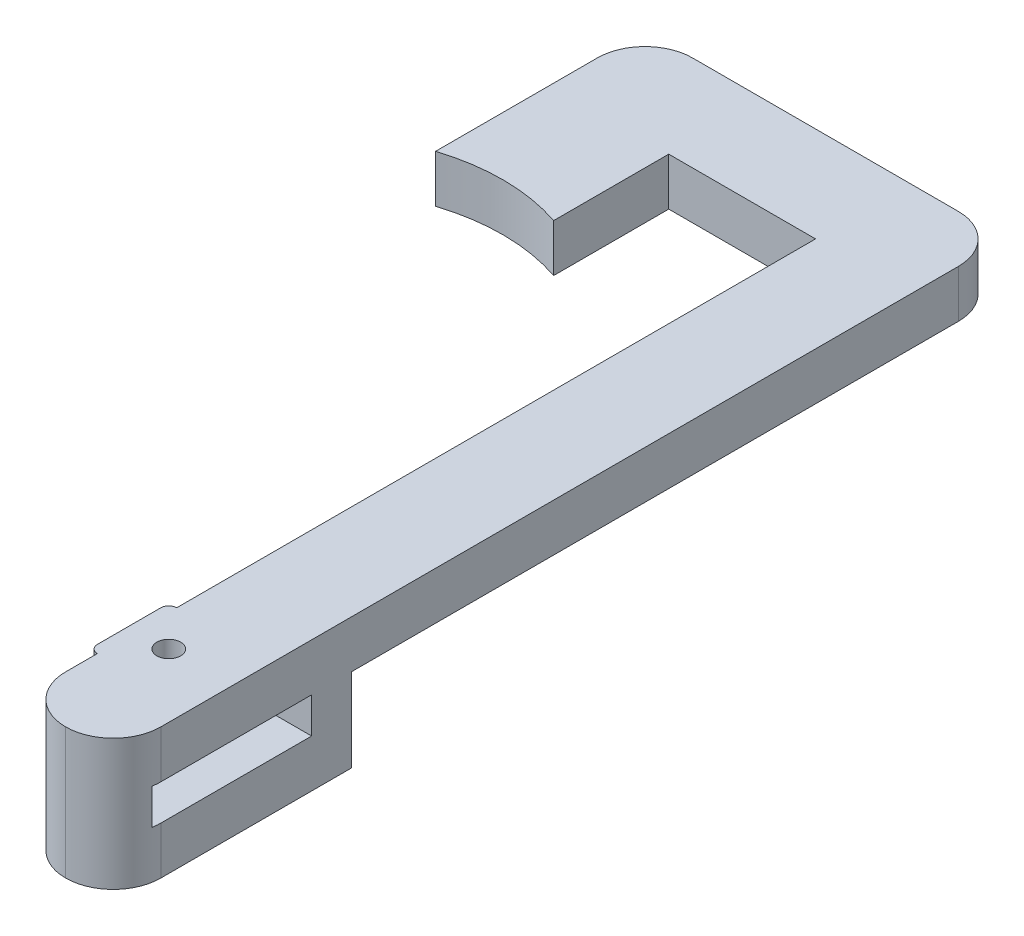
ISO-10303-21;
HEADER;
FILE_DESCRIPTION(('STEP AP214'),'2;1');
FILE_NAME('part.step','',(''),(''),'','','');
FILE_SCHEMA(('AUTOMOTIVE_DESIGN { 1 0 10303 214 1 1 1 1 }'));
ENDSEC;
DATA;
#1=APPLICATION_CONTEXT('core data for automotive mechanical design processes');
#2=APPLICATION_PROTOCOL_DEFINITION('international standard','automotive_design',2000,#1);
#3=PRODUCT_CONTEXT('',#1,'mechanical');
#4=PRODUCT('Part','Part','',(#3));
#5=PRODUCT_RELATED_PRODUCT_CATEGORY('part','',(#4));
#6=PRODUCT_DEFINITION_FORMATION('','',#4);
#7=PRODUCT_DEFINITION_CONTEXT('part definition',#1,'design');
#8=PRODUCT_DEFINITION('design','',#6,#7);
#9=PRODUCT_DEFINITION_SHAPE('','',#8);
#10=(LENGTH_UNIT() NAMED_UNIT(*) SI_UNIT(.MILLI.,.METRE.));
#11=(NAMED_UNIT(*) PLANE_ANGLE_UNIT() SI_UNIT($,.RADIAN.));
#12=(NAMED_UNIT(*) SI_UNIT($,.STERADIAN.) SOLID_ANGLE_UNIT());
#13=UNCERTAINTY_MEASURE_WITH_UNIT(LENGTH_MEASURE(1.E-05),#10,'distance_accuracy_value','');
#14=(GEOMETRIC_REPRESENTATION_CONTEXT(3) GLOBAL_UNCERTAINTY_ASSIGNED_CONTEXT((#13)) GLOBAL_UNIT_ASSIGNED_CONTEXT((#10,
#11,#12)) REPRESENTATION_CONTEXT('',''));
#15=CARTESIAN_POINT('',(0.,0.,0.));
#16=DIRECTION('',(0.,0.,1.));
#17=DIRECTION('',(1.,0.,0.));
#18=AXIS2_PLACEMENT_3D('',#15,#16,#17);
#19=CARTESIAN_POINT('',(-2.00000000000002,3.,0.));
#20=DIRECTION('',(-1.,0.,0.));
#21=DIRECTION('',(0.,0.,1.));
#22=AXIS2_PLACEMENT_3D('',#19,#20,#21);
#23=PLANE('',#22);
#24=DIRECTION('',(0.,1.,0.));
#25=VECTOR('',#24,1.);
#26=CARTESIAN_POINT('',(-2.00000000000001,-10.2749378105604,-2.5));
#27=LINE('',#26,#25);
#28=CARTESIAN_POINT('',(-2.00000000000001,-5.25,-2.5));
#29=VERTEX_POINT('',#28);
#30=CARTESIAN_POINT('',(-2.00000000000001,-2.25,-2.5));
#31=VERTEX_POINT('',#30);
#32=EDGE_CURVE('E220',#29,#31,#27,.T.);
#33=ORIENTED_EDGE('',*,*,#32,.T.);
#34=DIRECTION('',(0.,0.,1.));
#35=VECTOR('',#34,1.);
#36=CARTESIAN_POINT('',(-2.00000000000001,-2.25,-11.7082039324994));
#37=LINE('',#36,#35);
#38=CARTESIAN_POINT('',(-2.00000000000001,-2.25,-5.00000000000001));
#39=VERTEX_POINT('',#38);
#40=EDGE_CURVE('E231',#39,#31,#37,.T.);
#41=ORIENTED_EDGE('',*,*,#40,.F.);
#42=DIRECTION('',(0.,1.,0.));
#43=VECTOR('',#42,1.);
#44=CARTESIAN_POINT('',(-2.00000000000004,-5.25,-5.00000000000002));
#45=LINE('',#44,#43);
#46=CARTESIAN_POINT('',(-2.00000000000004,0.,-5.00000000000002));
#47=VERTEX_POINT('',#46);
#48=EDGE_CURVE('E276',#39,#47,#45,.T.);
#49=ORIENTED_EDGE('',*,*,#48,.T.);
#50=DIRECTION('',(0.,0.,-1.));
#51=VECTOR('',#50,1.);
#52=CARTESIAN_POINT('',(-2.00000000000002,0.,0.));
#53=LINE('',#52,#51);
#54=CARTESIAN_POINT('',(-2.00000000000003,0.,-2.50000000000002));
#55=VERTEX_POINT('',#54);
#56=EDGE_CURVE('E332',#55,#47,#53,.T.);
#57=ORIENTED_EDGE('',*,*,#56,.F.);
#58=DIRECTION('',(0.,-1.,0.));
#59=VECTOR('',#58,1.);
#60=CARTESIAN_POINT('',(-2.00000000000003,3.,-2.50000000000002));
#61=LINE('',#60,#59);
#62=CARTESIAN_POINT('',(-2.00000000000003,3.,-2.50000000000002));
#63=VERTEX_POINT('',#62);
#64=EDGE_CURVE('E338',#63,#55,#61,.T.);
#65=ORIENTED_EDGE('',*,*,#64,.F.);
#66=DIRECTION('',(0.,0.,-1.));
#67=VECTOR('',#66,1.);
#68=CARTESIAN_POINT('',(-2.00000000000002,3.,0.));
#69=LINE('',#68,#67);
#70=CARTESIAN_POINT('',(-2.00000000000017,3.,-42.75));
#71=VERTEX_POINT('',#70);
#72=EDGE_CURVE('E309',#63,#71,#69,.T.);
#73=ORIENTED_EDGE('',*,*,#72,.T.);
#74=DIRECTION('',(0.,-1.,0.));
#75=VECTOR('',#74,1.);
#76=CARTESIAN_POINT('',(-2.00000000000017,3.,-42.75));
#77=LINE('',#76,#75);
#78=CARTESIAN_POINT('',(-2.00000000000017,0.,-42.75));
#79=VERTEX_POINT('',#78);
#80=EDGE_CURVE('E341',#71,#79,#77,.T.);
#81=ORIENTED_EDGE('',*,*,#80,.T.);
#82=CARTESIAN_POINT('',(-2.00000000000005,0.,-7.50000000000002));
#83=VERTEX_POINT('',#82);
#84=EDGE_CURVE('E331',#83,#79,#53,.T.);
#85=ORIENTED_EDGE('',*,*,#84,.F.);
#86=DIRECTION('',(0.,1.,0.));
#87=VECTOR('',#86,1.);
#88=CARTESIAN_POINT('',(-2.00000000000005,-5.25,-7.50000000000003));
#89=LINE('',#88,#87);
#90=CARTESIAN_POINT('',(-2.00000000000005,-5.25,-7.50000000000003));
#91=VERTEX_POINT('',#90);
#92=EDGE_CURVE('E273',#91,#83,#89,.T.);
#93=ORIENTED_EDGE('',*,*,#92,.F.);
#94=DIRECTION('',(0.,0.,-1.));
#95=VECTOR('',#94,1.);
#96=CARTESIAN_POINT('',(-2.00000000000002,-5.25,0.));
#97=LINE('',#96,#95);
#98=EDGE_CURVE('E234',#29,#91,#97,.T.);
#99=ORIENTED_EDGE('',*,*,#98,.F.);
#100=EDGE_LOOP('',(#33,#41,#49,#57,#65,#73,#81,#85,#93,#99));
#101=FACE_BOUND('',#100,.T.);
#102=ADVANCED_FACE('F37',(#101),#23,.T.);
#103=DIRECTION('',(0.,1.,0.));
#104=VECTOR('',#103,1.);
#105=CARTESIAN_POINT('',(-2.00000000000001,-10.2749378105604,2.5));
#106=LINE('',#105,#104);
#107=CARTESIAN_POINT('',(-2.00000000000001,-5.25,2.5));
#108=VERTEX_POINT('',#107);
#109=CARTESIAN_POINT('',(-2.00000000000001,-2.25,2.5));
#110=VERTEX_POINT('',#109);
#111=EDGE_CURVE('E236',#108,#110,#106,.T.);
#112=ORIENTED_EDGE('',*,*,#111,.F.);
#113=CARTESIAN_POINT('',(-2.00000000000001,-5.25,4.50000000000001));
#114=VERTEX_POINT('',#113);
#115=EDGE_CURVE('E261',#114,#108,#97,.T.);
#116=ORIENTED_EDGE('',*,*,#115,.F.);
#117=DIRECTION('',(0.,-1.,0.));
#118=VECTOR('',#117,1.);
#119=CARTESIAN_POINT('',(-2.00000000000001,3.,4.50000000000001));
#120=LINE('',#119,#118);
#121=CARTESIAN_POINT('',(-2.00000000000001,-2.25,4.50000000000001));
#122=VERTEX_POINT('',#121);
#123=EDGE_CURVE('E395',#114,#122,#120,.F.);
#124=ORIENTED_EDGE('',*,*,#123,.T.);
#125=EDGE_CURVE('E243',#110,#122,#37,.T.);
#126=ORIENTED_EDGE('',*,*,#125,.F.);
#127=EDGE_LOOP('',(#112,#116,#124,#126));
#128=FACE_BOUND('',#127,.T.);
#129=ADVANCED_FACE('F464',(#128),#23,.T.);
#130=CARTESIAN_POINT('',(0.,-5.25,-5.00000000000001));
#131=DIRECTION('',(0.,0.,-1.));
#132=DIRECTION('',(-1.,0.,0.));
#133=AXIS2_PLACEMENT_3D('',#130,#131,#132);
#134=PLANE('',#133);
#135=DIRECTION('',(1.,0.,0.));
#136=VECTOR('',#135,1.);
#137=CARTESIAN_POINT('',(3.99999999999996,-2.25,-4.99999999999999));
#138=LINE('',#137,#136);
#139=CARTESIAN_POINT('',(3.99999999999999,-2.25,-4.99999999999999));
#140=VERTEX_POINT('',#139);
#141=EDGE_CURVE('E240',#39,#140,#138,.T.);
#142=ORIENTED_EDGE('',*,*,#141,.T.);
#143=DIRECTION('',(0.,1.,0.));
#144=VECTOR('',#143,1.);
#145=CARTESIAN_POINT('',(3.99999999999996,-5.25,-4.99999999999999));
#146=LINE('',#145,#144);
#147=CARTESIAN_POINT('',(3.99999999999996,0.,-5.00000000000001));
#148=VERTEX_POINT('',#147);
#149=EDGE_CURVE('E278',#140,#148,#146,.T.);
#150=ORIENTED_EDGE('',*,*,#149,.T.);
#151=DIRECTION('',(-1.,0.,0.));
#152=VECTOR('',#151,1.);
#153=CARTESIAN_POINT('',(0.,0.,-5.00000000000001));
#154=LINE('',#153,#152);
#155=EDGE_CURVE('E256',#148,#47,#154,.T.);
#156=ORIENTED_EDGE('',*,*,#155,.T.);
#157=ORIENTED_EDGE('',*,*,#48,.F.);
#158=EDGE_LOOP('',(#142,#150,#156,#157));
#159=FACE_BOUND('',#158,.T.);
#160=ADVANCED_FACE('F510',(#159),#134,.F.);
#161=CARTESIAN_POINT('',(0.,-5.25,4.99999999999999));
#162=DIRECTION('',(0.,0.,-1.));
#163=DIRECTION('',(-1.,0.,0.));
#164=AXIS2_PLACEMENT_3D('',#161,#162,#163);
#165=PLANE('',#164);
#166=DIRECTION('',(-1.,0.,0.));
#167=VECTOR('',#166,1.);
#168=CARTESIAN_POINT('',(0.,0.,4.99999999999999));
#169=LINE('',#168,#167);
#170=CARTESIAN_POINT('',(3.9580398915498,0.,4.99999999999999));
#171=VERTEX_POINT('',#170);
#172=CARTESIAN_POINT('',(-1.95803989154982,0.,4.99999999999999));
#173=VERTEX_POINT('',#172);
#174=EDGE_CURVE('E253',#171,#173,#169,.T.);
#175=ORIENTED_EDGE('',*,*,#174,.F.);
#176=DIRECTION('',(0.,-1.,0.));
#177=VECTOR('',#176,1.);
#178=CARTESIAN_POINT('',(3.9580398915498,0.,4.99999999999999));
#179=LINE('',#178,#177);
#180=CARTESIAN_POINT('',(3.9580398915498,-2.25,4.99999999999999));
#181=VERTEX_POINT('',#180);
#182=EDGE_CURVE('E383',#171,#181,#179,.T.);
#183=ORIENTED_EDGE('',*,*,#182,.T.);
#184=DIRECTION('',(1.,0.,0.));
#185=VECTOR('',#184,1.);
#186=CARTESIAN_POINT('',(3.99999999999999,-2.25,4.99999999999999));
#187=LINE('',#186,#185);
#188=CARTESIAN_POINT('',(-1.95803989154982,-2.25,4.99999999999999));
#189=VERTEX_POINT('',#188);
#190=EDGE_CURVE('E242',#189,#181,#187,.T.);
#191=ORIENTED_EDGE('',*,*,#190,.F.);
#192=DIRECTION('',(0.,1.,0.));
#193=VECTOR('',#192,1.);
#194=CARTESIAN_POINT('',(-1.95803989154982,-2.25,4.99999999999999));
#195=LINE('',#194,#193);
#196=EDGE_CURVE('E381',#189,#173,#195,.T.);
#197=ORIENTED_EDGE('',*,*,#196,.T.);
#198=EDGE_LOOP('',(#175,#183,#191,#197));
#199=FACE_BOUND('',#198,.T.);
#200=ADVANCED_FACE('F456',(#199),#165,.T.);
#201=CARTESIAN_POINT('',(0.,0.,0.));
#202=DIRECTION('',(0.,1.,0.));
#203=DIRECTION('',(0.,0.,1.));
#204=AXIS2_PLACEMENT_3D('',#201,#202,#203);
#205=PLANE('',#204);
#206=CARTESIAN_POINT('',(0.,0.,0.));
#207=DIRECTION('',(0.,1.,0.));
#208=DIRECTION('',(0.,0.,1.));
#209=AXIS2_PLACEMENT_3D('',#206,#207,#208);
#210=CIRCLE('',#209,0.75);
#211=CARTESIAN_POINT('',(0.,0.,0.75));
#212=VERTEX_POINT('',#211);
#213=EDGE_CURVE('E252',#212,#212,#210,.T.);
#214=ORIENTED_EDGE('',*,*,#213,.T.);
#215=EDGE_LOOP('',(#214));
#216=FACE_BOUND('',#215,.T.);
#217=DIRECTION('',(0.,0.,-1.));
#218=VECTOR('',#217,1.);
#219=CARTESIAN_POINT('',(-2.00000000000002,0.,0.));
#220=LINE('',#219,#218);
#221=CARTESIAN_POINT('',(-2.00000000000001,0.,4.50000000000001));
#222=VERTEX_POINT('',#221);
#223=CARTESIAN_POINT('',(-2.00000000000002,0.,2.49999999999998));
#224=VERTEX_POINT('',#223);
#225=EDGE_CURVE('E291',#222,#224,#220,.T.);
#226=ORIENTED_EDGE('',*,*,#225,.T.);
#227=CARTESIAN_POINT('',(-2.,0.,1.99999999999998));
#228=DIRECTION('',(0.,1.,0.));
#229=DIRECTION('',(0.,0.,1.));
#230=AXIS2_PLACEMENT_3D('',#227,#228,#229);
#231=CIRCLE('',#230,0.5);
#232=CARTESIAN_POINT('',(-2.5,0.,1.99999999999998));
#233=VERTEX_POINT('',#232);
#234=EDGE_CURVE('E411',#224,#233,#231,.F.);
#235=ORIENTED_EDGE('',*,*,#234,.T.);
#236=DIRECTION('',(0.,0.,1.));
#237=VECTOR('',#236,1.);
#238=CARTESIAN_POINT('',(-2.5,0.,0.));
#239=LINE('',#238,#237);
#240=CARTESIAN_POINT('',(-2.5,0.,-2.00000000000002));
#241=VERTEX_POINT('',#240);
#242=EDGE_CURVE('E296',#241,#233,#239,.T.);
#243=ORIENTED_EDGE('',*,*,#242,.F.);
#244=CARTESIAN_POINT('',(-2.,0.,-2.00000000000002));
#245=DIRECTION('',(0.,1.,0.));
#246=DIRECTION('',(0.,0.,1.));
#247=AXIS2_PLACEMENT_3D('',#244,#245,#246);
#248=CIRCLE('',#247,0.5);
#249=EDGE_CURVE('E409',#241,#55,#248,.F.);
#250=ORIENTED_EDGE('',*,*,#249,.T.);
#251=ORIENTED_EDGE('',*,*,#56,.T.);
#252=ORIENTED_EDGE('',*,*,#155,.F.);
#253=DIRECTION('',(0.,0.,-1.));
#254=VECTOR('',#253,1.);
#255=CARTESIAN_POINT('',(3.99999999999998,0.,0.));
#256=LINE('',#255,#254);
#257=CARTESIAN_POINT('',(3.99999999999999,0.,4.49999999999999));
#258=VERTEX_POINT('',#257);
#259=EDGE_CURVE('E318',#258,#148,#256,.T.);
#260=ORIENTED_EDGE('',*,*,#259,.F.);
#261=CARTESIAN_POINT('',(0.999999999999992,0.,4.5));
#262=DIRECTION('',(0.,1.,0.));
#263=DIRECTION('',(0.,0.,1.));
#264=AXIS2_PLACEMENT_3D('',#261,#262,#263);
#265=CIRCLE('',#264,3.);
#266=EDGE_CURVE('E379',#258,#171,#265,.F.);
#267=ORIENTED_EDGE('',*,*,#266,.T.);
#268=ORIENTED_EDGE('',*,*,#174,.T.);
#269=CARTESIAN_POINT('',(0.999999999999991,0.,4.5));
#270=DIRECTION('',(0.,1.,0.));
#271=DIRECTION('',(0.,0.,1.));
#272=AXIS2_PLACEMENT_3D('',#269,#270,#271);
#273=CIRCLE('',#272,3.);
#274=EDGE_CURVE('E377',#173,#222,#273,.F.);
#275=ORIENTED_EDGE('',*,*,#274,.T.);
#276=EDGE_LOOP('',(#226,#235,#243,#250,#251,#252,#260,#267,#268,#275));
#277=FACE_BOUND('',#276,.T.);
#278=ADVANCED_FACE('F421',(#216,#277),#205,.F.);
#279=CARTESIAN_POINT('',(3.99999999999998,3.,0.));
#280=DIRECTION('',(-1.,0.,0.));
#281=DIRECTION('',(0.,0.,1.));
#282=AXIS2_PLACEMENT_3D('',#279,#280,#281);
#283=PLANE('',#282);
#284=CARTESIAN_POINT('',(3.99999999999995,0.,-7.50000000000002));
#285=VERTEX_POINT('',#284);
#286=CARTESIAN_POINT('',(3.99999999999982,0.,-45.7500000000001));
#287=VERTEX_POINT('',#286);
#288=EDGE_CURVE('E317',#285,#287,#256,.T.);
#289=ORIENTED_EDGE('',*,*,#288,.T.);
#290=DIRECTION('',(0.,-1.,0.));
#291=VECTOR('',#290,1.);
#292=CARTESIAN_POINT('',(3.99999999999982,3.,-45.7500000000001));
#293=LINE('',#292,#291);
#294=CARTESIAN_POINT('',(3.99999999999982,3.,-45.7500000000001));
#295=VERTEX_POINT('',#294);
#296=EDGE_CURVE('E375',#287,#295,#293,.F.);
#297=ORIENTED_EDGE('',*,*,#296,.T.);
#298=DIRECTION('',(0.,0.,-1.));
#299=VECTOR('',#298,1.);
#300=CARTESIAN_POINT('',(3.99999999999998,3.,0.));
#301=LINE('',#300,#299);
#302=CARTESIAN_POINT('',(3.99999999999999,3.,4.49999999999999));
#303=VERTEX_POINT('',#302);
#304=EDGE_CURVE('E295',#303,#295,#301,.T.);
#305=ORIENTED_EDGE('',*,*,#304,.F.);
#306=DIRECTION('',(0.,-1.,0.));
#307=VECTOR('',#306,1.);
#308=CARTESIAN_POINT('',(3.99999999999999,3.,4.49999999999999));
#309=LINE('',#308,#307);
#310=EDGE_CURVE('E372',#303,#258,#309,.T.);
#311=ORIENTED_EDGE('',*,*,#310,.T.);
#312=ORIENTED_EDGE('',*,*,#259,.T.);
#313=ORIENTED_EDGE('',*,*,#149,.F.);
#314=DIRECTION('',(0.,0.,1.));
#315=VECTOR('',#314,1.);
#316=CARTESIAN_POINT('',(3.99999999999999,-2.25,-11.7082039324994));
#317=LINE('',#316,#315);
#318=CARTESIAN_POINT('',(3.99999999999999,-2.25,4.49999999999999));
#319=VERTEX_POINT('',#318);
#320=EDGE_CURVE('E247',#140,#319,#317,.T.);
#321=ORIENTED_EDGE('',*,*,#320,.T.);
#322=DIRECTION('',(0.,-1.,0.));
#323=VECTOR('',#322,1.);
#324=CARTESIAN_POINT('',(3.99999999999999,3.,4.49999999999999));
#325=LINE('',#324,#323);
#326=CARTESIAN_POINT('',(3.99999999999999,-5.25,4.49999999999999));
#327=VERTEX_POINT('',#326);
#328=EDGE_CURVE('E370',#319,#327,#325,.T.);
#329=ORIENTED_EDGE('',*,*,#328,.T.);
#330=DIRECTION('',(0.,0.,1.));
#331=VECTOR('',#330,1.);
#332=CARTESIAN_POINT('',(3.99999999999998,-5.25,0.));
#333=LINE('',#332,#331);
#334=CARTESIAN_POINT('',(3.99999999999995,-5.25,-7.50000000000002));
#335=VERTEX_POINT('',#334);
#336=EDGE_CURVE('E257',#335,#327,#333,.T.);
#337=ORIENTED_EDGE('',*,*,#336,.F.);
#338=DIRECTION('',(0.,1.,0.));
#339=VECTOR('',#338,1.);
#340=CARTESIAN_POINT('',(3.99999999999995,-5.25,-7.50000000000002));
#341=LINE('',#340,#339);
#342=EDGE_CURVE('E267',#335,#285,#341,.T.);
#343=ORIENTED_EDGE('',*,*,#342,.T.);
#344=EDGE_LOOP('',(#289,#297,#305,#311,#312,#313,#321,#329,#337,#343));
#345=FACE_BOUND('',#344,.T.);
#346=ADVANCED_FACE('F447',(#345),#283,.F.);
#347=CARTESIAN_POINT('',(-1.93297758751701E-13,3.,-48.7500000000001));
#348=DIRECTION('',(0.,0.,1.));
#349=DIRECTION('',(1.,0.,0.));
#350=AXIS2_PLACEMENT_3D('',#347,#348,#349);
#351=PLANE('',#350);
#352=DIRECTION('',(-1.,0.,0.));
#353=VECTOR('',#352,1.);
#354=CARTESIAN_POINT('',(-1.93297758751701E-13,0.,-48.7500000000001));
#355=LINE('',#354,#353);
#356=CARTESIAN_POINT('',(0.999999999999812,0.,-48.7500000000001));
#357=VERTEX_POINT('',#356);
#358=CARTESIAN_POINT('',(-15.7500000000002,0.,-48.75));
#359=VERTEX_POINT('',#358);
#360=EDGE_CURVE('E320',#357,#359,#355,.T.);
#361=ORIENTED_EDGE('',*,*,#360,.T.);
#362=DIRECTION('',(0.,-1.,0.));
#363=VECTOR('',#362,1.);
#364=CARTESIAN_POINT('',(-15.7500000000002,3.,-48.75));
#365=LINE('',#364,#363);
#366=CARTESIAN_POINT('',(-15.7500000000002,3.,-48.75));
#367=VERTEX_POINT('',#366);
#368=EDGE_CURVE('E360',#359,#367,#365,.F.);
#369=ORIENTED_EDGE('',*,*,#368,.T.);
#370=DIRECTION('',(-1.,0.,0.));
#371=VECTOR('',#370,1.);
#372=CARTESIAN_POINT('',(-1.93297758751701E-13,3.,-48.7500000000001));
#373=LINE('',#372,#371);
#374=CARTESIAN_POINT('',(0.999999999999812,3.,-48.7500000000001));
#375=VERTEX_POINT('',#374);
#376=EDGE_CURVE('E299',#375,#367,#373,.T.);
#377=ORIENTED_EDGE('',*,*,#376,.F.);
#378=DIRECTION('',(0.,-1.,0.));
#379=VECTOR('',#378,1.);
#380=CARTESIAN_POINT('',(0.999999999999812,3.,-48.7500000000001));
#381=LINE('',#380,#379);
#382=EDGE_CURVE('E357',#375,#357,#381,.T.);
#383=ORIENTED_EDGE('',*,*,#382,.T.);
#384=EDGE_LOOP('',(#361,#369,#377,#383));
#385=FACE_BOUND('',#384,.T.);
#386=ADVANCED_FACE('F530',(#385),#351,.F.);
#387=CARTESIAN_POINT('',(-18.7500000000001,3.,0.));
#388=DIRECTION('',(1.,0.,0.));
#389=DIRECTION('',(0.,0.,-1.));
#390=AXIS2_PLACEMENT_3D('',#387,#388,#389);
#391=PLANE('',#390);
#392=DIRECTION('',(0.,0.,1.));
#393=VECTOR('',#392,1.);
#394=CARTESIAN_POINT('',(-18.7500000000001,3.,0.));
#395=LINE('',#394,#393);
#396=CARTESIAN_POINT('',(-18.7500000000002,3.,-45.75));
#397=VERTEX_POINT('',#396);
#398=CARTESIAN_POINT('',(-18.7500000000002,3.,-35.5584236212457));
#399=VERTEX_POINT('',#398);
#400=EDGE_CURVE('E302',#397,#399,#395,.T.);
#401=ORIENTED_EDGE('',*,*,#400,.F.);
#402=DIRECTION('',(0.,-1.,0.));
#403=VECTOR('',#402,1.);
#404=CARTESIAN_POINT('',(-18.7500000000002,3.,-45.75));
#405=LINE('',#404,#403);
#406=CARTESIAN_POINT('',(-18.7500000000002,0.,-45.75));
#407=VERTEX_POINT('',#406);
#408=EDGE_CURVE('E346',#397,#407,#405,.T.);
#409=ORIENTED_EDGE('',*,*,#408,.T.);
#410=DIRECTION('',(0.,0.,1.));
#411=VECTOR('',#410,1.);
#412=CARTESIAN_POINT('',(-18.7500000000001,0.,0.));
#413=LINE('',#412,#411);
#414=CARTESIAN_POINT('',(-18.7500000000002,0.,-35.5584236212457));
#415=VERTEX_POINT('',#414);
#416=EDGE_CURVE('E323',#407,#415,#413,.T.);
#417=ORIENTED_EDGE('',*,*,#416,.T.);
#418=DIRECTION('',(0.,1.,0.));
#419=VECTOR('',#418,1.);
#420=CARTESIAN_POINT('',(-18.7500000000002,-33.9411254969543,-35.5584236212457));
#421=LINE('',#420,#419);
#422=EDGE_CURVE('E288',#415,#399,#421,.T.);
#423=ORIENTED_EDGE('',*,*,#422,.T.);
#424=EDGE_LOOP('',(#401,#409,#417,#423));
#425=FACE_BOUND('',#424,.T.);
#426=ADVANCED_FACE('F524',(#425),#391,.F.);
#427=CARTESIAN_POINT('',(-11.2500000000008,3.,-2.20247927039215E-13));
#428=DIRECTION('',(1.,0.,0.));
#429=DIRECTION('',(0.,0.,-1.));
#430=AXIS2_PLACEMENT_3D('',#427,#428,#429);
#431=PLANE('',#430);
#432=DIRECTION('',(0.,1.,0.));
#433=VECTOR('',#432,1.);
#434=CARTESIAN_POINT('',(-11.2500000000001,-33.9411254969543,-35.4979453173743));
#435=LINE('',#434,#433);
#436=CARTESIAN_POINT('',(-11.2500000000001,0.,-35.4979453173743));
#437=VERTEX_POINT('',#436);
#438=CARTESIAN_POINT('',(-11.2500000000001,3.,-35.4979453173743));
#439=VERTEX_POINT('',#438);
#440=EDGE_CURVE('E286',#437,#439,#435,.T.);
#441=ORIENTED_EDGE('',*,*,#440,.F.);
#442=DIRECTION('',(0.,0.,1.));
#443=VECTOR('',#442,1.);
#444=CARTESIAN_POINT('',(-11.2500000000008,0.,-2.20247927039215E-13));
#445=LINE('',#444,#443);
#446=CARTESIAN_POINT('',(-11.25,0.,-42.75));
#447=VERTEX_POINT('',#446);
#448=EDGE_CURVE('E325',#447,#437,#445,.T.);
#449=ORIENTED_EDGE('',*,*,#448,.F.);
#450=DIRECTION('',(0.,-1.,0.));
#451=VECTOR('',#450,1.);
#452=CARTESIAN_POINT('',(-11.25,3.,-42.75));
#453=LINE('',#452,#451);
#454=CARTESIAN_POINT('',(-11.25,3.,-42.75));
#455=VERTEX_POINT('',#454);
#456=EDGE_CURVE('E344',#455,#447,#453,.T.);
#457=ORIENTED_EDGE('',*,*,#456,.F.);
#458=DIRECTION('',(0.,0.,1.));
#459=VECTOR('',#458,1.);
#460=CARTESIAN_POINT('',(-11.2500000000008,3.,-2.20247927039215E-13));
#461=LINE('',#460,#459);
#462=EDGE_CURVE('E304',#455,#439,#461,.T.);
#463=ORIENTED_EDGE('',*,*,#462,.T.);
#464=EDGE_LOOP('',(#441,#449,#457,#463));
#465=FACE_BOUND('',#464,.T.);
#466=ADVANCED_FACE('F519',(#465),#431,.T.);
#467=CARTESIAN_POINT('',(0.,3.,-42.75));
#468=DIRECTION('',(0.,0.,-1.));
#469=DIRECTION('',(-1.,0.,0.));
#470=AXIS2_PLACEMENT_3D('',#467,#468,#469);
#471=PLANE('',#470);
#472=DIRECTION('',(1.,0.,0.));
#473=VECTOR('',#472,1.);
#474=CARTESIAN_POINT('',(0.,0.,-42.75));
#475=LINE('',#474,#473);
#476=EDGE_CURVE('E328',#447,#79,#475,.T.);
#477=ORIENTED_EDGE('',*,*,#476,.T.);
#478=ORIENTED_EDGE('',*,*,#80,.F.);
#479=DIRECTION('',(1.,0.,0.));
#480=VECTOR('',#479,1.);
#481=CARTESIAN_POINT('',(0.,3.,-42.75));
#482=LINE('',#481,#480);
#483=EDGE_CURVE('E307',#455,#71,#482,.T.);
#484=ORIENTED_EDGE('',*,*,#483,.F.);
#485=ORIENTED_EDGE('',*,*,#456,.T.);
#486=EDGE_LOOP('',(#477,#478,#484,#485));
#487=FACE_BOUND('',#486,.T.);
#488=ADVANCED_FACE('F514',(#487),#471,.F.);
#489=ORIENTED_EDGE('',*,*,#225,.F.);
#490=DIRECTION('',(0.,-1.,0.));
#491=VECTOR('',#490,1.);
#492=CARTESIAN_POINT('',(-2.00000000000001,3.,4.50000000000001));
#493=LINE('',#492,#491);
#494=CARTESIAN_POINT('',(-2.00000000000001,3.,4.50000000000001));
#495=VERTEX_POINT('',#494);
#496=EDGE_CURVE('E393',#222,#495,#493,.F.);
#497=ORIENTED_EDGE('',*,*,#496,.T.);
#498=DIRECTION('',(0.,0.,-1.));
#499=VECTOR('',#498,1.);
#500=CARTESIAN_POINT('',(-2.00000000000002,3.,0.));
#501=LINE('',#500,#499);
#502=CARTESIAN_POINT('',(-2.00000000000002,3.,2.49999999999998));
#503=VERTEX_POINT('',#502);
#504=EDGE_CURVE('E292',#495,#503,#501,.T.);
#505=ORIENTED_EDGE('',*,*,#504,.T.);
#506=DIRECTION('',(0.,-1.,0.));
#507=VECTOR('',#506,1.);
#508=CARTESIAN_POINT('',(-2.00000000000002,3.,2.49999999999998));
#509=LINE('',#508,#507);
#510=EDGE_CURVE('E314',#503,#224,#509,.T.);
#511=ORIENTED_EDGE('',*,*,#510,.T.);
#512=EDGE_LOOP('',(#489,#497,#505,#511));
#513=FACE_BOUND('',#512,.T.);
#514=ADVANCED_FACE('F432',(#513),#23,.T.);
#515=CARTESIAN_POINT('',(-2.5,3.,0.));
#516=DIRECTION('',(1.,0.,0.));
#517=DIRECTION('',(0.,0.,-1.));
#518=AXIS2_PLACEMENT_3D('',#515,#516,#517);
#519=PLANE('',#518);
#520=ORIENTED_EDGE('',*,*,#242,.T.);
#521=DIRECTION('',(0.,-1.,0.));
#522=VECTOR('',#521,1.);
#523=CARTESIAN_POINT('',(-2.5,3.,1.99999999999998));
#524=LINE('',#523,#522);
#525=CARTESIAN_POINT('',(-2.5,3.,1.99999999999998));
#526=VERTEX_POINT('',#525);
#527=EDGE_CURVE('E52',#233,#526,#524,.F.);
#528=ORIENTED_EDGE('',*,*,#527,.T.);
#529=DIRECTION('',(0.,0.,1.));
#530=VECTOR('',#529,1.);
#531=CARTESIAN_POINT('',(-2.5,3.,0.));
#532=LINE('',#531,#530);
#533=CARTESIAN_POINT('',(-2.5,3.,-2.00000000000002));
#534=VERTEX_POINT('',#533);
#535=EDGE_CURVE('E312',#534,#526,#532,.T.);
#536=ORIENTED_EDGE('',*,*,#535,.F.);
#537=DIRECTION('',(0.,-1.,0.));
#538=VECTOR('',#537,1.);
#539=CARTESIAN_POINT('',(-2.5,0.,-2.00000000000002));
#540=LINE('',#539,#538);
#541=EDGE_CURVE('E413',#534,#241,#540,.T.);
#542=ORIENTED_EDGE('',*,*,#541,.T.);
#543=EDGE_LOOP('',(#520,#528,#536,#542));
#544=FACE_BOUND('',#543,.T.);
#545=ADVANCED_FACE('F418',(#544),#519,.F.);
#546=CARTESIAN_POINT('',(0.,3.,0.));
#547=DIRECTION('',(0.,1.,0.));
#548=DIRECTION('',(0.,0.,1.));
#549=AXIS2_PLACEMENT_3D('',#546,#547,#548);
#550=PLANE('',#549);
#551=CARTESIAN_POINT('',(0.,3.,0.));
#552=DIRECTION('',(0.,1.,0.));
#553=DIRECTION('',(0.,0.,1.));
#554=AXIS2_PLACEMENT_3D('',#551,#552,#553);
#555=CIRCLE('',#554,0.75);
#556=CARTESIAN_POINT('',(0.,3.,0.75));
#557=VERTEX_POINT('',#556);
#558=EDGE_CURVE('E400',#557,#557,#555,.T.);
#559=ORIENTED_EDGE('',*,*,#558,.F.);
#560=EDGE_LOOP('',(#559));
#561=FACE_BOUND('',#560,.T.);
#562=ORIENTED_EDGE('',*,*,#535,.T.);
#563=CARTESIAN_POINT('',(-2.,3.,1.99999999999998));
#564=DIRECTION('',(0.,1.,0.));
#565=DIRECTION('',(0.,0.,1.));
#566=AXIS2_PLACEMENT_3D('',#563,#564,#565);
#567=CIRCLE('',#566,0.5);
#568=EDGE_CURVE('E11',#526,#503,#567,.T.);
#569=ORIENTED_EDGE('',*,*,#568,.T.);
#570=ORIENTED_EDGE('',*,*,#504,.F.);
#571=CARTESIAN_POINT('',(0.999999999999991,3.,4.5));
#572=DIRECTION('',(0.,1.,0.));
#573=DIRECTION('',(0.,0.,1.));
#574=AXIS2_PLACEMENT_3D('',#571,#572,#573);
#575=CIRCLE('',#574,3.);
#576=CARTESIAN_POINT('',(0.999999999999991,3.,7.5));
#577=VERTEX_POINT('',#576);
#578=EDGE_CURVE('E362',#495,#577,#575,.T.);
#579=ORIENTED_EDGE('',*,*,#578,.T.);
#580=CARTESIAN_POINT('',(0.999999999999992,3.,4.5));
#581=DIRECTION('',(0.,1.,0.));
#582=DIRECTION('',(0.,0.,1.));
#583=AXIS2_PLACEMENT_3D('',#580,#581,#582);
#584=CIRCLE('',#583,3.);
#585=EDGE_CURVE('E364',#577,#303,#584,.T.);
#586=ORIENTED_EDGE('',*,*,#585,.T.);
#587=ORIENTED_EDGE('',*,*,#304,.T.);
#588=CARTESIAN_POINT('',(0.999999999999824,3.,-45.7500000000001));
#589=DIRECTION('',(0.,1.,0.));
#590=DIRECTION('',(0.,0.,1.));
#591=AXIS2_PLACEMENT_3D('',#588,#589,#590);
#592=CIRCLE('',#591,3.);
#593=EDGE_CURVE('E366',#295,#375,#592,.T.);
#594=ORIENTED_EDGE('',*,*,#593,.T.);
#595=ORIENTED_EDGE('',*,*,#376,.T.);
#596=CARTESIAN_POINT('',(-15.7500000000002,3.,-45.75));
#597=DIRECTION('',(0.,1.,0.));
#598=DIRECTION('',(0.,0.,1.));
#599=AXIS2_PLACEMENT_3D('',#596,#597,#598);
#600=CIRCLE('',#599,3.);
#601=EDGE_CURVE('E368',#367,#397,#600,.T.);
#602=ORIENTED_EDGE('',*,*,#601,.T.);
#603=ORIENTED_EDGE('',*,*,#400,.T.);
#604=CARTESIAN_POINT('',(-15.091915752101,3.,-24.1295820511095));
#605=DIRECTION('',(0.,1.,0.));
#606=DIRECTION('',(0.,0.,1.));
#607=AXIS2_PLACEMENT_3D('',#604,#605,#606);
#608=CIRCLE('',#607,12.);
#609=EDGE_CURVE('E281',#439,#399,#608,.T.);
#610=ORIENTED_EDGE('',*,*,#609,.F.);
#611=ORIENTED_EDGE('',*,*,#462,.F.);
#612=ORIENTED_EDGE('',*,*,#483,.T.);
#613=ORIENTED_EDGE('',*,*,#72,.F.);
#614=CARTESIAN_POINT('',(-2.,3.,-2.00000000000002));
#615=DIRECTION('',(0.,1.,0.));
#616=DIRECTION('',(0.,0.,1.));
#617=AXIS2_PLACEMENT_3D('',#614,#615,#616);
#618=CIRCLE('',#617,0.5);
#619=EDGE_CURVE('E45',#63,#534,#618,.T.);
#620=ORIENTED_EDGE('',*,*,#619,.T.);
#621=EDGE_LOOP('',(#562,#569,#570,#579,#586,#587,#594,#595,#602,#603,#610,#611,#612,#613,#620));
#622=FACE_BOUND('',#621,.T.);
#623=ADVANCED_FACE('F429',(#561,#622),#550,.T.);
#624=ORIENTED_EDGE('',*,*,#416,.F.);
#625=CARTESIAN_POINT('',(-15.7500000000002,0.,-45.75));
#626=DIRECTION('',(0.,1.,0.));
#627=DIRECTION('',(0.,0.,1.));
#628=AXIS2_PLACEMENT_3D('',#625,#626,#627);
#629=CIRCLE('',#628,3.);
#630=EDGE_CURVE('E355',#407,#359,#629,.F.);
#631=ORIENTED_EDGE('',*,*,#630,.T.);
#632=ORIENTED_EDGE('',*,*,#360,.F.);
#633=CARTESIAN_POINT('',(0.999999999999824,0.,-45.7500000000001));
#634=DIRECTION('',(0.,1.,0.));
#635=DIRECTION('',(0.,0.,1.));
#636=AXIS2_PLACEMENT_3D('',#633,#634,#635);
#637=CIRCLE('',#636,3.);
#638=EDGE_CURVE('E353',#357,#287,#637,.F.);
#639=ORIENTED_EDGE('',*,*,#638,.T.);
#640=ORIENTED_EDGE('',*,*,#288,.F.);
#641=DIRECTION('',(-1.,0.,0.));
#642=VECTOR('',#641,1.);
#643=CARTESIAN_POINT('',(0.,0.,-7.50000000000002));
#644=LINE('',#643,#642);
#645=EDGE_CURVE('E260',#285,#83,#644,.T.);
#646=ORIENTED_EDGE('',*,*,#645,.T.);
#647=ORIENTED_EDGE('',*,*,#84,.T.);
#648=ORIENTED_EDGE('',*,*,#476,.F.);
#649=ORIENTED_EDGE('',*,*,#448,.T.);
#650=CARTESIAN_POINT('',(-15.091915752101,0.,-24.1295820511095));
#651=DIRECTION('',(0.,1.,0.));
#652=DIRECTION('',(0.,0.,1.));
#653=AXIS2_PLACEMENT_3D('',#650,#651,#652);
#654=CIRCLE('',#653,12.);
#655=EDGE_CURVE('E284',#415,#437,#654,.F.);
#656=ORIENTED_EDGE('',*,*,#655,.F.);
#657=EDGE_LOOP('',(#624,#631,#632,#639,#640,#646,#647,#648,#649,#656));
#658=FACE_BOUND('',#657,.T.);
#659=ADVANCED_FACE('F581',(#658),#205,.F.);
#660=CARTESIAN_POINT('',(-15.091915752101,-33.9411254969543,-24.1295820511095));
#661=DIRECTION('',(0.,1.,0.));
#662=DIRECTION('',(0.,0.,1.));
#663=AXIS2_PLACEMENT_3D('',#660,#661,#662);
#664=CYLINDRICAL_SURFACE('',#663,12.);
#665=ORIENTED_EDGE('',*,*,#655,.T.);
#666=ORIENTED_EDGE('',*,*,#440,.T.);
#667=ORIENTED_EDGE('',*,*,#609,.T.);
#668=ORIENTED_EDGE('',*,*,#422,.F.);
#669=EDGE_LOOP('',(#665,#666,#667,#668));
#670=FACE_BOUND('',#669,.T.);
#671=ADVANCED_FACE('F578',(#670),#664,.F.);
#672=CARTESIAN_POINT('',(0.,-5.25,-7.50000000000002));
#673=DIRECTION('',(0.,0.,-1.));
#674=DIRECTION('',(-1.,0.,0.));
#675=AXIS2_PLACEMENT_3D('',#672,#673,#674);
#676=PLANE('',#675);
#677=ORIENTED_EDGE('',*,*,#645,.F.);
#678=ORIENTED_EDGE('',*,*,#342,.F.);
#679=DIRECTION('',(-1.,0.,0.));
#680=VECTOR('',#679,1.);
#681=CARTESIAN_POINT('',(0.,-5.25,-7.50000000000002));
#682=LINE('',#681,#680);
#683=EDGE_CURVE('E264',#335,#91,#682,.T.);
#684=ORIENTED_EDGE('',*,*,#683,.T.);
#685=ORIENTED_EDGE('',*,*,#92,.T.);
#686=EDGE_LOOP('',(#677,#678,#684,#685));
#687=FACE_BOUND('',#686,.T.);
#688=ADVANCED_FACE('F562',(#687),#676,.T.);
#689=CARTESIAN_POINT('',(0.,-5.25,0.));
#690=DIRECTION('',(0.,-1.,0.));
#691=DIRECTION('',(0.,0.,-1.));
#692=AXIS2_PLACEMENT_3D('',#689,#690,#691);
#693=PLANE('',#692);
#694=CARTESIAN_POINT('',(0.,-5.25,0.));
#695=DIRECTION('',(0.,-1.,0.));
#696=DIRECTION('',(0.,0.,-1.));
#697=AXIS2_PLACEMENT_3D('',#694,#695,#696);
#698=CIRCLE('',#697,0.75);
#699=CARTESIAN_POINT('',(0.,-5.25,-0.75));
#700=VERTEX_POINT('',#699);
#701=EDGE_CURVE('E350',#700,#700,#698,.F.);
#702=ORIENTED_EDGE('',*,*,#701,.T.);
#703=EDGE_LOOP('',(#702));
#704=FACE_BOUND('',#703,.T.);
#705=ORIENTED_EDGE('',*,*,#115,.T.);
#706=CARTESIAN_POINT('',(-2.00000000000001,-5.25,2.));
#707=DIRECTION('',(0.,-1.,0.));
#708=DIRECTION('',(0.,0.,-1.));
#709=AXIS2_PLACEMENT_3D('',#706,#707,#708);
#710=CIRCLE('',#709,0.5);
#711=CARTESIAN_POINT('',(-2.50000000000001,-5.25,2.));
#712=VERTEX_POINT('',#711);
#713=EDGE_CURVE('E407',#108,#712,#710,.T.);
#714=ORIENTED_EDGE('',*,*,#713,.T.);
#715=DIRECTION('',(0.,0.,1.));
#716=VECTOR('',#715,1.);
#717=CARTESIAN_POINT('',(-2.50000000000001,-5.25,-2.5));
#718=LINE('',#717,#716);
#719=CARTESIAN_POINT('',(-2.50000000000001,-5.25,-2.));
#720=VERTEX_POINT('',#719);
#721=EDGE_CURVE('E476',#720,#712,#718,.T.);
#722=ORIENTED_EDGE('',*,*,#721,.F.);
#723=CARTESIAN_POINT('',(-2.00000000000001,-5.25,-2.));
#724=DIRECTION('',(0.,-1.,0.));
#725=DIRECTION('',(0.,0.,-1.));
#726=AXIS2_PLACEMENT_3D('',#723,#724,#725);
#727=CIRCLE('',#726,0.5);
#728=EDGE_CURVE('E405',#720,#29,#727,.T.);
#729=ORIENTED_EDGE('',*,*,#728,.T.);
#730=ORIENTED_EDGE('',*,*,#98,.T.);
#731=ORIENTED_EDGE('',*,*,#683,.F.);
#732=ORIENTED_EDGE('',*,*,#336,.T.);
#733=CARTESIAN_POINT('',(0.999999999999992,-5.25,4.5));
#734=DIRECTION('',(0.,-1.,0.));
#735=DIRECTION('',(0.,0.,-1.));
#736=AXIS2_PLACEMENT_3D('',#733,#734,#735);
#737=CIRCLE('',#736,3.);
#738=CARTESIAN_POINT('',(0.999999999999991,-5.25,7.5));
#739=VERTEX_POINT('',#738);
#740=EDGE_CURVE('E391',#327,#739,#737,.T.);
#741=ORIENTED_EDGE('',*,*,#740,.T.);
#742=CARTESIAN_POINT('',(0.999999999999991,-5.25,4.5));
#743=DIRECTION('',(0.,-1.,0.));
#744=DIRECTION('',(0.,0.,-1.));
#745=AXIS2_PLACEMENT_3D('',#742,#743,#744);
#746=CIRCLE('',#745,3.);
#747=EDGE_CURVE('E389',#739,#114,#746,.T.);
#748=ORIENTED_EDGE('',*,*,#747,.T.);
#749=EDGE_LOOP('',(#705,#714,#722,#729,#730,#731,#732,#741,#748));
#750=FACE_BOUND('',#749,.T.);
#751=ADVANCED_FACE('F467',(#704,#750),#693,.T.);
#752=CARTESIAN_POINT('',(3.99999999999999,-2.25,-11.7082039324994));
#753=DIRECTION('',(0.,-1.,0.));
#754=DIRECTION('',(0.,0.,-1.));
#755=AXIS2_PLACEMENT_3D('',#752,#753,#754);
#756=PLANE('',#755);
#757=CARTESIAN_POINT('',(0.,-2.25,0.));
#758=DIRECTION('',(0.,-1.,0.));
#759=DIRECTION('',(0.,0.,-1.));
#760=AXIS2_PLACEMENT_3D('',#757,#758,#759);
#761=CIRCLE('',#760,0.75);
#762=CARTESIAN_POINT('',(0.,-2.25,-0.75));
#763=VERTEX_POINT('',#762);
#764=EDGE_CURVE('E347',#763,#763,#761,.T.);
#765=ORIENTED_EDGE('',*,*,#764,.T.);
#766=EDGE_LOOP('',(#765));
#767=FACE_BOUND('',#766,.T.);
#768=DIRECTION('',(0.,0.,1.));
#769=VECTOR('',#768,1.);
#770=CARTESIAN_POINT('',(-2.50000000000001,-2.25,-2.5));
#771=LINE('',#770,#769);
#772=CARTESIAN_POINT('',(-2.50000000000001,-2.25,-2.));
#773=VERTEX_POINT('',#772);
#774=CARTESIAN_POINT('',(-2.50000000000001,-2.25,2.));
#775=VERTEX_POINT('',#774);
#776=EDGE_CURVE('E475',#773,#775,#771,.T.);
#777=ORIENTED_EDGE('',*,*,#776,.T.);
#778=CARTESIAN_POINT('',(-2.00000000000001,-2.25,2.));
#779=DIRECTION('',(0.,-1.,0.));
#780=DIRECTION('',(0.,0.,-1.));
#781=AXIS2_PLACEMENT_3D('',#778,#779,#780);
#782=CIRCLE('',#781,0.5);
#783=EDGE_CURVE('E226',#775,#110,#782,.F.);
#784=ORIENTED_EDGE('',*,*,#783,.T.);
#785=ORIENTED_EDGE('',*,*,#125,.T.);
#786=CARTESIAN_POINT('',(0.999999999999991,-2.25,4.5));
#787=DIRECTION('',(0.,-1.,0.));
#788=DIRECTION('',(0.,0.,-1.));
#789=AXIS2_PLACEMENT_3D('',#786,#787,#788);
#790=CIRCLE('',#789,3.);
#791=EDGE_CURVE('E385',#122,#189,#790,.F.);
#792=ORIENTED_EDGE('',*,*,#791,.T.);
#793=ORIENTED_EDGE('',*,*,#190,.T.);
#794=CARTESIAN_POINT('',(0.999999999999992,-2.25,4.5));
#795=DIRECTION('',(0.,-1.,0.));
#796=DIRECTION('',(0.,0.,-1.));
#797=AXIS2_PLACEMENT_3D('',#794,#795,#796);
#798=CIRCLE('',#797,3.);
#799=EDGE_CURVE('E387',#181,#319,#798,.F.);
#800=ORIENTED_EDGE('',*,*,#799,.T.);
#801=ORIENTED_EDGE('',*,*,#320,.F.);
#802=ORIENTED_EDGE('',*,*,#141,.F.);
#803=ORIENTED_EDGE('',*,*,#40,.T.);
#804=CARTESIAN_POINT('',(-2.00000000000001,-2.25,-2.));
#805=DIRECTION('',(0.,-1.,0.));
#806=DIRECTION('',(0.,0.,-1.));
#807=AXIS2_PLACEMENT_3D('',#804,#805,#806);
#808=CIRCLE('',#807,0.5);
#809=EDGE_CURVE('E216',#31,#773,#808,.F.);
#810=ORIENTED_EDGE('',*,*,#809,.T.);
#811=EDGE_LOOP('',(#777,#784,#785,#792,#793,#800,#801,#802,#803,#810));
#812=FACE_BOUND('',#811,.T.);
#813=ADVANCED_FACE('F238',(#767,#812),#756,.F.);
#814=CARTESIAN_POINT('',(0.,-7.37132034355964,0.));
#815=DIRECTION('',(0.,1.,0.));
#816=DIRECTION('',(0.,0.,1.));
#817=AXIS2_PLACEMENT_3D('',#814,#815,#816);
#818=CYLINDRICAL_SURFACE('',#817,0.75);
#819=ORIENTED_EDGE('',*,*,#701,.F.);
#820=EDGE_LOOP('',(#819));
#821=FACE_BOUND('',#820,.T.);
#822=ORIENTED_EDGE('',*,*,#764,.F.);
#823=EDGE_LOOP('',(#822));
#824=FACE_BOUND('',#823,.T.);
#825=ADVANCED_FACE('F492',(#821,#824),#818,.F.);
#826=ORIENTED_EDGE('',*,*,#558,.T.);
#827=EDGE_LOOP('',(#826));
#828=FACE_BOUND('',#827,.T.);
#829=ORIENTED_EDGE('',*,*,#213,.F.);
#830=EDGE_LOOP('',(#829));
#831=FACE_BOUND('',#830,.T.);
#832=ADVANCED_FACE('F489',(#828,#831),#818,.F.);
#833=CARTESIAN_POINT('',(-15.7500000000002,3.,-45.75));
#834=DIRECTION('',(0.,-1.,0.));
#835=DIRECTION('',(0.,0.,-1.));
#836=AXIS2_PLACEMENT_3D('',#833,#834,#835);
#837=CYLINDRICAL_SURFACE('',#836,3.);
#838=ORIENTED_EDGE('',*,*,#601,.F.);
#839=ORIENTED_EDGE('',*,*,#368,.F.);
#840=ORIENTED_EDGE('',*,*,#630,.F.);
#841=ORIENTED_EDGE('',*,*,#408,.F.);
#842=EDGE_LOOP('',(#838,#839,#840,#841));
#843=FACE_BOUND('',#842,.T.);
#844=ADVANCED_FACE('F491',(#843),#837,.T.);
#845=CARTESIAN_POINT('',(0.999999999999824,3.,-45.7500000000001));
#846=DIRECTION('',(0.,-1.,0.));
#847=DIRECTION('',(0.,0.,-1.));
#848=AXIS2_PLACEMENT_3D('',#845,#846,#847);
#849=CYLINDRICAL_SURFACE('',#848,3.);
#850=ORIENTED_EDGE('',*,*,#593,.F.);
#851=ORIENTED_EDGE('',*,*,#296,.F.);
#852=ORIENTED_EDGE('',*,*,#638,.F.);
#853=ORIENTED_EDGE('',*,*,#382,.F.);
#854=EDGE_LOOP('',(#850,#851,#852,#853));
#855=FACE_BOUND('',#854,.T.);
#856=ADVANCED_FACE('F499',(#855),#849,.T.);
#857=CARTESIAN_POINT('',(0.999999999999991,3.,4.5));
#858=DIRECTION('',(0.,1.,0.));
#859=DIRECTION('',(0.,0.,1.));
#860=AXIS2_PLACEMENT_3D('',#857,#858,#859);
#861=CYLINDRICAL_SURFACE('',#860,3.);
#862=DIRECTION('',(0.,-1.,0.));
#863=VECTOR('',#862,1.);
#864=CARTESIAN_POINT('',(0.999999999999991,-5.25,7.5));
#865=LINE('',#864,#863);
#866=EDGE_CURVE('E235',#577,#739,#865,.T.);
#867=ORIENTED_EDGE('',*,*,#866,.F.);
#868=ORIENTED_EDGE('',*,*,#578,.F.);
#869=ORIENTED_EDGE('',*,*,#496,.F.);
#870=ORIENTED_EDGE('',*,*,#274,.F.);
#871=ORIENTED_EDGE('',*,*,#196,.F.);
#872=ORIENTED_EDGE('',*,*,#791,.F.);
#873=ORIENTED_EDGE('',*,*,#123,.F.);
#874=ORIENTED_EDGE('',*,*,#747,.F.);
#875=EDGE_LOOP('',(#867,#868,#869,#870,#871,#872,#873,#874));
#876=FACE_BOUND('',#875,.T.);
#877=ADVANCED_FACE('F437',(#876),#861,.T.);
#878=CARTESIAN_POINT('',(0.999999999999992,3.,4.5));
#879=DIRECTION('',(0.,-1.,0.));
#880=DIRECTION('',(0.,0.,-1.));
#881=AXIS2_PLACEMENT_3D('',#878,#879,#880);
#882=CYLINDRICAL_SURFACE('',#881,3.);
#883=ORIENTED_EDGE('',*,*,#585,.F.);
#884=ORIENTED_EDGE('',*,*,#866,.T.);
#885=ORIENTED_EDGE('',*,*,#740,.F.);
#886=ORIENTED_EDGE('',*,*,#328,.F.);
#887=ORIENTED_EDGE('',*,*,#799,.F.);
#888=ORIENTED_EDGE('',*,*,#182,.F.);
#889=ORIENTED_EDGE('',*,*,#266,.F.);
#890=ORIENTED_EDGE('',*,*,#310,.F.);
#891=EDGE_LOOP('',(#883,#884,#885,#886,#887,#888,#889,#890));
#892=FACE_BOUND('',#891,.T.);
#893=ADVANCED_FACE('F450',(#892),#882,.T.);
#894=CARTESIAN_POINT('',(-2.50000000000001,-10.2749378105604,-2.5));
#895=DIRECTION('',(-1.,0.,0.));
#896=DIRECTION('',(0.,0.,1.));
#897=AXIS2_PLACEMENT_3D('',#894,#895,#896);
#898=PLANE('',#897);
#899=ORIENTED_EDGE('',*,*,#721,.T.);
#900=DIRECTION('',(0.,1.,0.));
#901=VECTOR('',#900,1.);
#902=CARTESIAN_POINT('',(-2.50000000000001,-10.2749378105604,2.));
#903=LINE('',#902,#901);
#904=EDGE_CURVE('E227',#712,#775,#903,.T.);
#905=ORIENTED_EDGE('',*,*,#904,.T.);
#906=ORIENTED_EDGE('',*,*,#776,.F.);
#907=DIRECTION('',(0.,1.,0.));
#908=VECTOR('',#907,1.);
#909=CARTESIAN_POINT('',(-2.50000000000001,-10.2749378105604,-2.));
#910=LINE('',#909,#908);
#911=EDGE_CURVE('E221',#773,#720,#910,.F.);
#912=ORIENTED_EDGE('',*,*,#911,.T.);
#913=EDGE_LOOP('',(#899,#905,#906,#912));
#914=FACE_BOUND('',#913,.T.);
#915=ADVANCED_FACE('F474',(#914),#898,.T.);
#916=CARTESIAN_POINT('',(-2.00000000000001,-10.2749378105604,2.));
#917=DIRECTION('',(0.,1.,0.));
#918=DIRECTION('',(0.,0.,1.));
#919=AXIS2_PLACEMENT_3D('',#916,#917,#918);
#920=CYLINDRICAL_SURFACE('',#919,0.5);
#921=ORIENTED_EDGE('',*,*,#713,.F.);
#922=ORIENTED_EDGE('',*,*,#111,.T.);
#923=ORIENTED_EDGE('',*,*,#783,.F.);
#924=ORIENTED_EDGE('',*,*,#904,.F.);
#925=EDGE_LOOP('',(#921,#922,#923,#924));
#926=FACE_BOUND('',#925,.T.);
#927=ADVANCED_FACE('F472',(#926),#920,.T.);
#928=CARTESIAN_POINT('',(-2.00000000000001,-10.2749378105604,-2.));
#929=DIRECTION('',(0.,1.,0.));
#930=DIRECTION('',(0.,0.,1.));
#931=AXIS2_PLACEMENT_3D('',#928,#929,#930);
#932=CYLINDRICAL_SURFACE('',#931,0.5);
#933=ORIENTED_EDGE('',*,*,#728,.F.);
#934=ORIENTED_EDGE('',*,*,#911,.F.);
#935=ORIENTED_EDGE('',*,*,#809,.F.);
#936=ORIENTED_EDGE('',*,*,#32,.F.);
#937=EDGE_LOOP('',(#933,#934,#935,#936));
#938=FACE_BOUND('',#937,.T.);
#939=ADVANCED_FACE('F219',(#938),#932,.T.);
#940=CARTESIAN_POINT('',(-2.,3.,1.99999999999998));
#941=DIRECTION('',(0.,-1.,0.));
#942=DIRECTION('',(0.,0.,-1.));
#943=AXIS2_PLACEMENT_3D('',#940,#941,#942);
#944=CYLINDRICAL_SURFACE('',#943,0.5);
#945=ORIENTED_EDGE('',*,*,#568,.F.);
#946=ORIENTED_EDGE('',*,*,#527,.F.);
#947=ORIENTED_EDGE('',*,*,#234,.F.);
#948=ORIENTED_EDGE('',*,*,#510,.F.);
#949=EDGE_LOOP('',(#945,#946,#947,#948));
#950=FACE_BOUND('',#949,.T.);
#951=ADVANCED_FACE('F427',(#950),#944,.T.);
#952=CARTESIAN_POINT('',(-2.,3.,-2.00000000000002));
#953=DIRECTION('',(0.,1.,0.));
#954=DIRECTION('',(0.,0.,1.));
#955=AXIS2_PLACEMENT_3D('',#952,#953,#954);
#956=CYLINDRICAL_SURFACE('',#955,0.5);
#957=ORIENTED_EDGE('',*,*,#619,.F.);
#958=ORIENTED_EDGE('',*,*,#64,.T.);
#959=ORIENTED_EDGE('',*,*,#249,.F.);
#960=ORIENTED_EDGE('',*,*,#541,.F.);
#961=EDGE_LOOP('',(#957,#958,#959,#960));
#962=FACE_BOUND('',#961,.T.);
#963=ADVANCED_FACE('F39',(#962),#956,.T.);
#964=CLOSED_SHELL('',(#102,#129,#160,#200,#278,#346,#386,#426,#466,#488,#514,#545,#623,#659,
#671,#688,#751,#813,#825,#832,#844,#856,#877,#893,#915,#927,#939,#951,#963));
#965=MANIFOLD_SOLID_BREP('B2',#964);
#966=ADVANCED_BREP_SHAPE_REPRESENTATION('',(#18,#965),#14);
#967=SHAPE_DEFINITION_REPRESENTATION(#9,#966);
ENDSEC;
END-ISO-10303-21;
